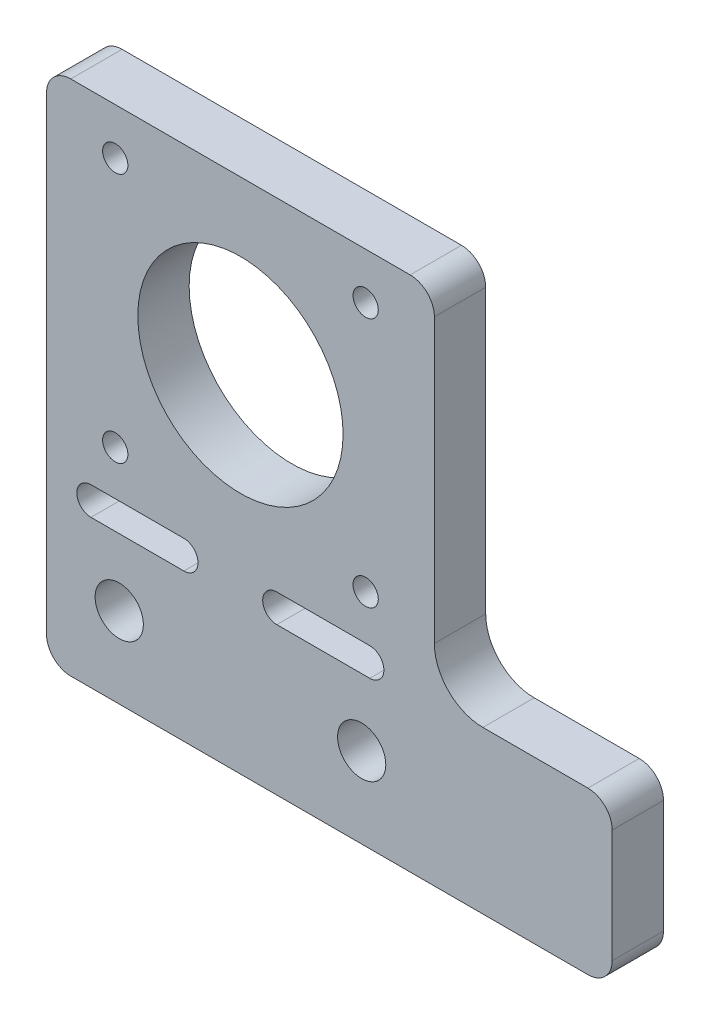
ISO-10303-21;
HEADER;
FILE_DESCRIPTION(('STEP AP214'),'2;1');
FILE_NAME('part.step','',(''),(''),'','','');
FILE_SCHEMA(('AUTOMOTIVE_DESIGN { 1 0 10303 214 1 1 1 1 }'));
ENDSEC;
DATA;
#1=APPLICATION_CONTEXT('core data for automotive mechanical design processes');
#2=APPLICATION_PROTOCOL_DEFINITION('international standard','automotive_design',2000,#1);
#3=PRODUCT_CONTEXT('',#1,'mechanical');
#4=PRODUCT('Part','Part','',(#3));
#5=PRODUCT_RELATED_PRODUCT_CATEGORY('part','',(#4));
#6=PRODUCT_DEFINITION_FORMATION('','',#4);
#7=PRODUCT_DEFINITION_CONTEXT('part definition',#1,'design');
#8=PRODUCT_DEFINITION('design','',#6,#7);
#9=PRODUCT_DEFINITION_SHAPE('','',#8);
#10=(LENGTH_UNIT() NAMED_UNIT(*) SI_UNIT(.MILLI.,.METRE.));
#11=(NAMED_UNIT(*) PLANE_ANGLE_UNIT() SI_UNIT($,.RADIAN.));
#12=(NAMED_UNIT(*) SI_UNIT($,.STERADIAN.) SOLID_ANGLE_UNIT());
#13=UNCERTAINTY_MEASURE_WITH_UNIT(LENGTH_MEASURE(1.E-05),#10,'distance_accuracy_value','');
#14=(GEOMETRIC_REPRESENTATION_CONTEXT(3) GLOBAL_UNCERTAINTY_ASSIGNED_CONTEXT((#13)) GLOBAL_UNIT_ASSIGNED_CONTEXT((#10,
#11,#12)) REPRESENTATION_CONTEXT('',''));
#15=CARTESIAN_POINT('',(0.,0.,0.));
#16=DIRECTION('',(0.,0.,1.));
#17=DIRECTION('',(1.,0.,0.));
#18=AXIS2_PLACEMENT_3D('',#15,#16,#17);
#19=CARTESIAN_POINT('',(363.68370158847,172.03385422472,6.35));
#20=DIRECTION('',(0.,0.,1.));
#21=DIRECTION('',(1.,0.,0.));
#22=AXIS2_PLACEMENT_3D('',#19,#20,#21);
#23=PLANE('',#22);
#24=CARTESIAN_POINT('',(369.18970158864,227.30138278266,6.35));
#25=DIRECTION('',(0.,0.,1.));
#26=DIRECTION('',(1.,0.,0.));
#27=AXIS2_PLACEMENT_3D('',#24,#25,#26);
#28=CIRCLE('',#27,1.5624999992);
#29=CARTESIAN_POINT('',(370.75220158784,227.30138278266,6.35));
#30=VERTEX_POINT('',#29);
#31=EDGE_CURVE('E649',#30,#30,#28,.T.);
#32=ORIENTED_EDGE('',*,*,#31,.F.);
#33=EDGE_LOOP('',(#32));
#34=FACE_BOUND('',#33,.T.);
#35=CARTESIAN_POINT('',(400.17770158864,196.31338278266,6.35));
#36=DIRECTION('',(0.,0.,1.));
#37=DIRECTION('',(1.,0.,0.));
#38=AXIS2_PLACEMENT_3D('',#35,#36,#37);
#39=CIRCLE('',#38,1.5624999992);
#40=CARTESIAN_POINT('',(401.74020158784,196.31338278266,6.35));
#41=VERTEX_POINT('',#40);
#42=EDGE_CURVE('E661',#41,#41,#39,.T.);
#43=ORIENTED_EDGE('',*,*,#42,.F.);
#44=EDGE_LOOP('',(#43));
#45=FACE_BOUND('',#44,.T.);
#46=CARTESIAN_POINT('',(399.68370158858,179.03385422266,6.35));
#47=DIRECTION('',(0.,0.,1.));
#48=DIRECTION('',(1.,0.,0.));
#49=AXIS2_PLACEMENT_3D('',#46,#47,#48);
#50=CIRCLE('',#49,2.9845);
#51=CARTESIAN_POINT('',(402.66820158858,179.03385422266,6.35));
#52=VERTEX_POINT('',#51);
#53=EDGE_CURVE('E673',#52,#52,#50,.T.);
#54=ORIENTED_EDGE('',*,*,#53,.F.);
#55=EDGE_LOOP('',(#54));
#56=FACE_BOUND('',#55,.T.);
#57=DIRECTION('',(1.,0.,0.));
#58=VECTOR('',#57,1.);
#59=CARTESIAN_POINT('',(389.18370158786,187.29953812814,6.35));
#60=LINE('',#59,#58);
#61=CARTESIAN_POINT('',(389.18370158786,187.29953812814,6.35));
#62=VERTEX_POINT('',#61);
#63=CARTESIAN_POINT('',(400.68370158756,187.29953812814,6.35));
#64=VERTEX_POINT('',#63);
#65=EDGE_CURVE('E176',#62,#64,#60,.T.);
#66=ORIENTED_EDGE('',*,*,#65,.F.);
#67=CARTESIAN_POINT('',(389.18370158786,189.04953812826,6.35));
#68=DIRECTION('',(0.,0.,1.));
#69=DIRECTION('',(1.,0.,0.));
#70=AXIS2_PLACEMENT_3D('',#67,#68,#69);
#71=CIRCLE('',#70,1.75000000012);
#72=CARTESIAN_POINT('',(389.18370158786,190.79953812838,6.35));
#73=VERTEX_POINT('',#72);
#74=EDGE_CURVE('E168',#73,#62,#71,.T.);
#75=ORIENTED_EDGE('',*,*,#74,.F.);
#76=DIRECTION('',(-1.,0.,0.));
#77=VECTOR('',#76,1.);
#78=CARTESIAN_POINT('',(400.68370158756,190.79953812838,6.35));
#79=LINE('',#78,#77);
#80=CARTESIAN_POINT('',(400.68370158756,190.79953812838,6.35));
#81=VERTEX_POINT('',#80);
#82=EDGE_CURVE('E191',#81,#73,#79,.T.);
#83=ORIENTED_EDGE('',*,*,#82,.F.);
#84=CARTESIAN_POINT('',(400.68370158756,189.04953812826,6.35));
#85=DIRECTION('',(0.,0.,1.));
#86=DIRECTION('',(1.,0.,0.));
#87=AXIS2_PLACEMENT_3D('',#84,#85,#86);
#88=CIRCLE('',#87,1.75000000012);
#89=EDGE_CURVE('E189',#64,#81,#88,.T.);
#90=ORIENTED_EDGE('',*,*,#89,.F.);
#91=EDGE_LOOP('',(#66,#75,#83,#90));
#92=FACE_BOUND('',#91,.T.);
#93=CARTESIAN_POINT('',(363.68370158847,172.03385422472,6.35));
#94=DIRECTION('',(0.,0.,1.));
#95=DIRECTION('',(1.,0.,0.));
#96=AXIS2_PLACEMENT_3D('',#93,#94,#95);
#97=CIRCLE('',#96,3.00000000075001);
#98=CARTESIAN_POINT('',(360.68370158772,172.03385422472,6.35));
#99=VERTEX_POINT('',#98);
#100=CARTESIAN_POINT('',(363.68370158847,169.03385422397,6.35));
#101=VERTEX_POINT('',#100);
#102=EDGE_CURVE('E238',#99,#101,#97,.T.);
#103=ORIENTED_EDGE('',*,*,#102,.T.);
#104=DIRECTION('',(1.,0.,0.));
#105=VECTOR('',#104,1.);
#106=CARTESIAN_POINT('',(363.68370158847,169.03385422397,6.35));
#107=LINE('',#106,#105);
#108=CARTESIAN_POINT('',(427.68370158923,169.03385422397,6.35));
#109=VERTEX_POINT('',#108);
#110=EDGE_CURVE('E241',#101,#109,#107,.T.);
#111=ORIENTED_EDGE('',*,*,#110,.T.);
#112=CARTESIAN_POINT('',(427.68370158923,172.03385422472,6.35));
#113=DIRECTION('',(0.,0.,1.));
#114=DIRECTION('',(1.,0.,0.));
#115=AXIS2_PLACEMENT_3D('',#112,#113,#114);
#116=CIRCLE('',#115,3.00000000075001);
#117=CARTESIAN_POINT('',(430.68370158998,172.03385422472,6.35));
#118=VERTEX_POINT('',#117);
#119=EDGE_CURVE('E244',#109,#118,#116,.T.);
#120=ORIENTED_EDGE('',*,*,#119,.T.);
#121=DIRECTION('',(0.,1.,0.));
#122=VECTOR('',#121,1.);
#123=CARTESIAN_POINT('',(430.68370158998,186.03385422314,6.35));
#124=LINE('',#123,#122);
#125=CARTESIAN_POINT('',(430.68370158998,186.03385422314,6.35));
#126=VERTEX_POINT('',#125);
#127=EDGE_CURVE('E246',#118,#126,#124,.T.);
#128=ORIENTED_EDGE('',*,*,#127,.T.);
#129=CARTESIAN_POINT('',(427.6837015905,186.03385422314,6.35));
#130=DIRECTION('',(0.,0.,1.));
#131=DIRECTION('',(1.,0.,0.));
#132=AXIS2_PLACEMENT_3D('',#129,#130,#131);
#133=CIRCLE('',#132,2.99999999948002);
#134=CARTESIAN_POINT('',(427.68370158796,189.03385422262,6.35));
#135=VERTEX_POINT('',#134);
#136=EDGE_CURVE('E248',#126,#135,#133,.T.);
#137=ORIENTED_EDGE('',*,*,#136,.T.);
#138=DIRECTION('',(-1.,0.,0.));
#139=VECTOR('',#138,1.);
#140=CARTESIAN_POINT('',(414.68370158852,189.03385422262,6.35));
#141=LINE('',#140,#139);
#142=CARTESIAN_POINT('',(414.68370158852,189.03385422262,6.35));
#143=VERTEX_POINT('',#142);
#144=EDGE_CURVE('E250',#135,#143,#141,.T.);
#145=ORIENTED_EDGE('',*,*,#144,.T.);
#146=CARTESIAN_POINT('',(414.68370158852,195.03385422412,6.35));
#147=DIRECTION('',(0.,0.,-1.));
#148=DIRECTION('',(1.,0.,0.));
#149=AXIS2_PLACEMENT_3D('',#146,#147,#148);
#150=CIRCLE('',#149,6.0000000015);
#151=CARTESIAN_POINT('',(408.68370158702,195.03385422412,6.35));
#152=VERTEX_POINT('',#151);
#153=EDGE_CURVE('E252',#143,#152,#150,.T.);
#154=ORIENTED_EDGE('',*,*,#153,.T.);
#155=DIRECTION('',(0.,1.,0.));
#156=VECTOR('',#155,1.);
#157=CARTESIAN_POINT('',(408.68370158702,195.03385422412,6.35));
#158=LINE('',#157,#156);
#159=CARTESIAN_POINT('',(408.68370158702,230.03385422398,6.35));
#160=VERTEX_POINT('',#159);
#161=EDGE_CURVE('E254',#152,#160,#158,.T.);
#162=ORIENTED_EDGE('',*,*,#161,.T.);
#163=CARTESIAN_POINT('',(405.68370158754,230.03385422398,6.35));
#164=DIRECTION('',(0.,0.,1.));
#165=DIRECTION('',(1.,0.,0.));
#166=AXIS2_PLACEMENT_3D('',#163,#164,#165);
#167=CIRCLE('',#166,2.99999999948002);
#168=CARTESIAN_POINT('',(405.68370158754,233.03385422346,6.35));
#169=VERTEX_POINT('',#168);
#170=EDGE_CURVE('E256',#160,#169,#167,.T.);
#171=ORIENTED_EDGE('',*,*,#170,.T.);
#172=DIRECTION('',(-1.,0.,0.));
#173=VECTOR('',#172,1.);
#174=CARTESIAN_POINT('',(405.68370158754,233.03385422346,6.35));
#175=LINE('',#174,#173);
#176=CARTESIAN_POINT('',(363.6837015872,233.03385422346,6.35));
#177=VERTEX_POINT('',#176);
#178=EDGE_CURVE('E258',#169,#177,#175,.T.);
#179=ORIENTED_EDGE('',*,*,#178,.T.);
#180=CARTESIAN_POINT('',(363.6837015872,230.03385422398,6.35));
#181=DIRECTION('',(0.,0.,1.));
#182=DIRECTION('',(1.,0.,0.));
#183=AXIS2_PLACEMENT_3D('',#180,#181,#182);
#184=CIRCLE('',#183,2.99999999948002);
#185=CARTESIAN_POINT('',(360.68370158772,230.03385422398,6.35));
#186=VERTEX_POINT('',#185);
#187=EDGE_CURVE('E260',#177,#186,#184,.T.);
#188=ORIENTED_EDGE('',*,*,#187,.T.);
#189=DIRECTION('',(0.,-1.,0.));
#190=VECTOR('',#189,1.);
#191=CARTESIAN_POINT('',(360.68370158772,230.03385422398,6.35));
#192=LINE('',#191,#190);
#193=EDGE_CURVE('E262',#186,#99,#192,.T.);
#194=ORIENTED_EDGE('',*,*,#193,.T.);
#195=EDGE_LOOP('',(#103,#111,#120,#128,#137,#145,#154,#162,#171,#179,#188,#194));
#196=FACE_BOUND('',#195,.T.);
#197=DIRECTION('',(1.,0.,0.));
#198=VECTOR('',#197,1.);
#199=CARTESIAN_POINT('',(366.18370158846,187.29953812814,6.35));
#200=LINE('',#199,#198);
#201=CARTESIAN_POINT('',(366.18370158846,187.29953812814,6.35));
#202=VERTEX_POINT('',#201);
#203=CARTESIAN_POINT('',(377.68370158816,187.29953812814,6.35));
#204=VERTEX_POINT('',#203);
#205=EDGE_CURVE('E209',#202,#204,#200,.T.);
#206=ORIENTED_EDGE('',*,*,#205,.F.);
#207=CARTESIAN_POINT('',(366.18370158846,189.04953812826,6.35));
#208=DIRECTION('',(0.,0.,1.));
#209=DIRECTION('',(1.,0.,0.));
#210=AXIS2_PLACEMENT_3D('',#207,#208,#209);
#211=CIRCLE('',#210,1.75000000012);
#212=CARTESIAN_POINT('',(366.18370158846,190.79953812838,6.35));
#213=VERTEX_POINT('',#212);
#214=EDGE_CURVE('E207',#213,#202,#211,.T.);
#215=ORIENTED_EDGE('',*,*,#214,.F.);
#216=DIRECTION('',(-1.,0.,0.));
#217=VECTOR('',#216,1.);
#218=CARTESIAN_POINT('',(377.68370158816,190.79953812838,6.35));
#219=LINE('',#218,#217);
#220=CARTESIAN_POINT('',(377.68370158816,190.79953812838,6.35));
#221=VERTEX_POINT('',#220);
#222=EDGE_CURVE('E215',#221,#213,#219,.T.);
#223=ORIENTED_EDGE('',*,*,#222,.F.);
#224=CARTESIAN_POINT('',(377.68370158816,189.04953812826,6.35));
#225=DIRECTION('',(0.,0.,1.));
#226=DIRECTION('',(1.,0.,0.));
#227=AXIS2_PLACEMENT_3D('',#224,#225,#226);
#228=CIRCLE('',#227,1.75000000012);
#229=EDGE_CURVE('E212',#204,#221,#228,.T.);
#230=ORIENTED_EDGE('',*,*,#229,.F.);
#231=EDGE_LOOP('',(#206,#215,#223,#230));
#232=FACE_BOUND('',#231,.T.);
#233=CARTESIAN_POINT('',(369.6837015887,179.03385422266,6.35));
#234=DIRECTION('',(0.,0.,1.));
#235=DIRECTION('',(1.,0.,0.));
#236=AXIS2_PLACEMENT_3D('',#233,#234,#235);
#237=CIRCLE('',#236,2.9845);
#238=CARTESIAN_POINT('',(372.6682015887,179.03385422266,6.35));
#239=VERTEX_POINT('',#238);
#240=EDGE_CURVE('E197',#239,#239,#237,.T.);
#241=ORIENTED_EDGE('',*,*,#240,.F.);
#242=EDGE_LOOP('',(#241));
#243=FACE_BOUND('',#242,.T.);
#244=CARTESIAN_POINT('',(369.18970158864,196.31338278266,6.35));
#245=DIRECTION('',(0.,0.,1.));
#246=DIRECTION('',(1.,0.,0.));
#247=AXIS2_PLACEMENT_3D('',#244,#245,#246);
#248=CIRCLE('',#247,1.5624999992);
#249=CARTESIAN_POINT('',(370.75220158784,196.31338278266,6.35));
#250=VERTEX_POINT('',#249);
#251=EDGE_CURVE('E667',#250,#250,#248,.T.);
#252=ORIENTED_EDGE('',*,*,#251,.F.);
#253=EDGE_LOOP('',(#252));
#254=FACE_BOUND('',#253,.T.);
#255=CARTESIAN_POINT('',(384.68370158864,211.80738278266,6.35));
#256=DIRECTION('',(0.,0.,1.));
#257=DIRECTION('',(1.,0.,0.));
#258=AXIS2_PLACEMENT_3D('',#255,#256,#257);
#259=CIRCLE('',#258,12.7);
#260=CARTESIAN_POINT('',(397.38370158864,211.80738278266,6.35));
#261=VERTEX_POINT('',#260);
#262=EDGE_CURVE('E655',#261,#261,#259,.T.);
#263=ORIENTED_EDGE('',*,*,#262,.F.);
#264=EDGE_LOOP('',(#263));
#265=FACE_BOUND('',#264,.T.);
#266=CARTESIAN_POINT('',(400.17770158864,227.30138278266,6.35));
#267=DIRECTION('',(0.,0.,1.));
#268=DIRECTION('',(1.,0.,0.));
#269=AXIS2_PLACEMENT_3D('',#266,#267,#268);
#270=CIRCLE('',#269,1.5624999992);
#271=CARTESIAN_POINT('',(401.74020158784,227.30138278266,6.35));
#272=VERTEX_POINT('',#271);
#273=EDGE_CURVE('E640',#272,#272,#270,.T.);
#274=ORIENTED_EDGE('',*,*,#273,.F.);
#275=EDGE_LOOP('',(#274));
#276=FACE_BOUND('',#275,.T.);
#277=ADVANCED_FACE('F31',(#34,#45,#56,#92,#196,#232,#243,#254,#265,#276),#23,.T.);
#278=CARTESIAN_POINT('',(363.68370158847,172.03385422472,0.));
#279=DIRECTION('',(0.,0.,1.));
#280=DIRECTION('',(1.,0.,0.));
#281=AXIS2_PLACEMENT_3D('',#278,#279,#280);
#282=PLANE('',#281);
#283=CARTESIAN_POINT('',(369.18970158864,227.30138278266,0.));
#284=DIRECTION('',(0.,0.,1.));
#285=DIRECTION('',(1.,0.,0.));
#286=AXIS2_PLACEMENT_3D('',#283,#284,#285);
#287=CIRCLE('',#286,1.5624999992);
#288=CARTESIAN_POINT('',(370.75220158784,227.30138278266,0.));
#289=VERTEX_POINT('',#288);
#290=EDGE_CURVE('E646',#289,#289,#287,.T.);
#291=ORIENTED_EDGE('',*,*,#290,.T.);
#292=EDGE_LOOP('',(#291));
#293=FACE_BOUND('',#292,.T.);
#294=CARTESIAN_POINT('',(400.17770158864,196.31338278266,0.));
#295=DIRECTION('',(0.,0.,1.));
#296=DIRECTION('',(1.,0.,0.));
#297=AXIS2_PLACEMENT_3D('',#294,#295,#296);
#298=CIRCLE('',#297,1.5624999992);
#299=CARTESIAN_POINT('',(401.74020158784,196.31338278266,0.));
#300=VERTEX_POINT('',#299);
#301=EDGE_CURVE('E658',#300,#300,#298,.T.);
#302=ORIENTED_EDGE('',*,*,#301,.T.);
#303=EDGE_LOOP('',(#302));
#304=FACE_BOUND('',#303,.T.);
#305=CARTESIAN_POINT('',(399.68370158858,179.03385422266,0.));
#306=DIRECTION('',(0.,0.,1.));
#307=DIRECTION('',(1.,0.,0.));
#308=AXIS2_PLACEMENT_3D('',#305,#306,#307);
#309=CIRCLE('',#308,2.9845);
#310=CARTESIAN_POINT('',(402.66820158858,179.03385422266,0.));
#311=VERTEX_POINT('',#310);
#312=EDGE_CURVE('E670',#311,#311,#309,.T.);
#313=ORIENTED_EDGE('',*,*,#312,.T.);
#314=EDGE_LOOP('',(#313));
#315=FACE_BOUND('',#314,.T.);
#316=CARTESIAN_POINT('',(389.18370158786,189.04953812826,0.));
#317=DIRECTION('',(0.,0.,1.));
#318=DIRECTION('',(1.,0.,0.));
#319=AXIS2_PLACEMENT_3D('',#316,#317,#318);
#320=CIRCLE('',#319,1.75000000012);
#321=CARTESIAN_POINT('',(389.18370158786,190.79953812838,0.));
#322=VERTEX_POINT('',#321);
#323=CARTESIAN_POINT('',(389.18370158786,187.29953812814,0.));
#324=VERTEX_POINT('',#323);
#325=EDGE_CURVE('E54',#322,#324,#320,.T.);
#326=ORIENTED_EDGE('',*,*,#325,.T.);
#327=DIRECTION('',(1.,0.,0.));
#328=VECTOR('',#327,1.);
#329=CARTESIAN_POINT('',(389.18370158786,187.29953812814,0.));
#330=LINE('',#329,#328);
#331=CARTESIAN_POINT('',(400.68370158756,187.29953812814,0.));
#332=VERTEX_POINT('',#331);
#333=EDGE_CURVE('E183',#324,#332,#330,.T.);
#334=ORIENTED_EDGE('',*,*,#333,.T.);
#335=CARTESIAN_POINT('',(400.68370158756,189.04953812826,0.));
#336=DIRECTION('',(0.,0.,1.));
#337=DIRECTION('',(1.,0.,0.));
#338=AXIS2_PLACEMENT_3D('',#335,#336,#337);
#339=CIRCLE('',#338,1.75000000012);
#340=CARTESIAN_POINT('',(400.68370158756,190.79953812838,0.));
#341=VERTEX_POINT('',#340);
#342=EDGE_CURVE('E199',#332,#341,#339,.T.);
#343=ORIENTED_EDGE('',*,*,#342,.T.);
#344=DIRECTION('',(-1.,0.,0.));
#345=VECTOR('',#344,1.);
#346=CARTESIAN_POINT('',(400.68370158756,190.79953812838,0.));
#347=LINE('',#346,#345);
#348=EDGE_CURVE('E177',#341,#322,#347,.T.);
#349=ORIENTED_EDGE('',*,*,#348,.T.);
#350=EDGE_LOOP('',(#326,#334,#343,#349));
#351=FACE_BOUND('',#350,.T.);
#352=CARTESIAN_POINT('',(363.68370158847,172.03385422472,0.));
#353=DIRECTION('',(0.,0.,1.));
#354=DIRECTION('',(1.,0.,0.));
#355=AXIS2_PLACEMENT_3D('',#352,#353,#354);
#356=CIRCLE('',#355,3.00000000075001);
#357=CARTESIAN_POINT('',(360.68370158772,172.03385422472,0.));
#358=VERTEX_POINT('',#357);
#359=CARTESIAN_POINT('',(363.68370158847,169.03385422397,0.));
#360=VERTEX_POINT('',#359);
#361=EDGE_CURVE('E237',#358,#360,#356,.T.);
#362=ORIENTED_EDGE('',*,*,#361,.F.);
#363=DIRECTION('',(0.,-1.,0.));
#364=VECTOR('',#363,1.);
#365=CARTESIAN_POINT('',(360.68370158772,230.03385422398,0.));
#366=LINE('',#365,#364);
#367=CARTESIAN_POINT('',(360.68370158772,230.03385422398,0.));
#368=VERTEX_POINT('',#367);
#369=EDGE_CURVE('E242',#368,#358,#366,.T.);
#370=ORIENTED_EDGE('',*,*,#369,.F.);
#371=CARTESIAN_POINT('',(363.6837015872,230.03385422398,0.));
#372=DIRECTION('',(0.,0.,1.));
#373=DIRECTION('',(1.,0.,0.));
#374=AXIS2_PLACEMENT_3D('',#371,#372,#373);
#375=CIRCLE('',#374,2.99999999948002);
#376=CARTESIAN_POINT('',(363.6837015872,233.03385422346,0.));
#377=VERTEX_POINT('',#376);
#378=EDGE_CURVE('E285',#377,#368,#375,.T.);
#379=ORIENTED_EDGE('',*,*,#378,.F.);
#380=DIRECTION('',(-1.,0.,0.));
#381=VECTOR('',#380,1.);
#382=CARTESIAN_POINT('',(405.68370158754,233.03385422346,0.));
#383=LINE('',#382,#381);
#384=CARTESIAN_POINT('',(405.68370158754,233.03385422346,0.));
#385=VERTEX_POINT('',#384);
#386=EDGE_CURVE('E283',#385,#377,#383,.T.);
#387=ORIENTED_EDGE('',*,*,#386,.F.);
#388=CARTESIAN_POINT('',(405.68370158754,230.03385422398,0.));
#389=DIRECTION('',(0.,0.,1.));
#390=DIRECTION('',(1.,0.,0.));
#391=AXIS2_PLACEMENT_3D('',#388,#389,#390);
#392=CIRCLE('',#391,2.99999999948002);
#393=CARTESIAN_POINT('',(408.68370158702,230.03385422398,0.));
#394=VERTEX_POINT('',#393);
#395=EDGE_CURVE('E281',#394,#385,#392,.T.);
#396=ORIENTED_EDGE('',*,*,#395,.F.);
#397=DIRECTION('',(0.,1.,0.));
#398=VECTOR('',#397,1.);
#399=CARTESIAN_POINT('',(408.68370158702,195.03385422412,0.));
#400=LINE('',#399,#398);
#401=CARTESIAN_POINT('',(408.68370158702,195.03385422412,0.));
#402=VERTEX_POINT('',#401);
#403=EDGE_CURVE('E279',#402,#394,#400,.T.);
#404=ORIENTED_EDGE('',*,*,#403,.F.);
#405=CARTESIAN_POINT('',(414.68370158852,195.03385422412,0.));
#406=DIRECTION('',(0.,0.,-1.));
#407=DIRECTION('',(1.,0.,0.));
#408=AXIS2_PLACEMENT_3D('',#405,#406,#407);
#409=CIRCLE('',#408,6.0000000015);
#410=CARTESIAN_POINT('',(414.68370158852,189.03385422262,0.));
#411=VERTEX_POINT('',#410);
#412=EDGE_CURVE('E277',#411,#402,#409,.T.);
#413=ORIENTED_EDGE('',*,*,#412,.F.);
#414=DIRECTION('',(-1.,0.,0.));
#415=VECTOR('',#414,1.);
#416=CARTESIAN_POINT('',(414.68370158852,189.03385422262,0.));
#417=LINE('',#416,#415);
#418=CARTESIAN_POINT('',(427.68370158796,189.03385422262,0.));
#419=VERTEX_POINT('',#418);
#420=EDGE_CURVE('E275',#419,#411,#417,.T.);
#421=ORIENTED_EDGE('',*,*,#420,.F.);
#422=CARTESIAN_POINT('',(427.6837015905,186.03385422314,0.));
#423=DIRECTION('',(0.,0.,1.));
#424=DIRECTION('',(1.,0.,0.));
#425=AXIS2_PLACEMENT_3D('',#422,#423,#424);
#426=CIRCLE('',#425,2.99999999948002);
#427=CARTESIAN_POINT('',(430.68370158998,186.03385422314,0.));
#428=VERTEX_POINT('',#427);
#429=EDGE_CURVE('E273',#428,#419,#426,.T.);
#430=ORIENTED_EDGE('',*,*,#429,.F.);
#431=DIRECTION('',(0.,1.,0.));
#432=VECTOR('',#431,1.);
#433=CARTESIAN_POINT('',(430.68370158998,186.03385422314,0.));
#434=LINE('',#433,#432);
#435=CARTESIAN_POINT('',(430.68370158998,172.03385422472,0.));
#436=VERTEX_POINT('',#435);
#437=EDGE_CURVE('E271',#436,#428,#434,.T.);
#438=ORIENTED_EDGE('',*,*,#437,.F.);
#439=CARTESIAN_POINT('',(427.68370158923,172.03385422472,0.));
#440=DIRECTION('',(0.,0.,1.));
#441=DIRECTION('',(1.,0.,0.));
#442=AXIS2_PLACEMENT_3D('',#439,#440,#441);
#443=CIRCLE('',#442,3.00000000075001);
#444=CARTESIAN_POINT('',(427.68370158923,169.03385422397,0.));
#445=VERTEX_POINT('',#444);
#446=EDGE_CURVE('E269',#445,#436,#443,.T.);
#447=ORIENTED_EDGE('',*,*,#446,.F.);
#448=DIRECTION('',(1.,0.,0.));
#449=VECTOR('',#448,1.);
#450=CARTESIAN_POINT('',(363.68370158847,169.03385422397,0.));
#451=LINE('',#450,#449);
#452=EDGE_CURVE('E267',#360,#445,#451,.T.);
#453=ORIENTED_EDGE('',*,*,#452,.F.);
#454=EDGE_LOOP('',(#362,#370,#379,#387,#396,#404,#413,#421,#430,#438,#447,#453));
#455=FACE_BOUND('',#454,.T.);
#456=CARTESIAN_POINT('',(366.18370158846,189.04953812826,0.));
#457=DIRECTION('',(0.,0.,1.));
#458=DIRECTION('',(1.,0.,0.));
#459=AXIS2_PLACEMENT_3D('',#456,#457,#458);
#460=CIRCLE('',#459,1.75000000012);
#461=CARTESIAN_POINT('',(366.18370158846,190.79953812838,0.));
#462=VERTEX_POINT('',#461);
#463=CARTESIAN_POINT('',(366.18370158846,187.29953812814,0.));
#464=VERTEX_POINT('',#463);
#465=EDGE_CURVE('E184',#462,#464,#460,.T.);
#466=ORIENTED_EDGE('',*,*,#465,.T.);
#467=DIRECTION('',(1.,0.,0.));
#468=VECTOR('',#467,1.);
#469=CARTESIAN_POINT('',(366.18370158846,187.29953812814,0.));
#470=LINE('',#469,#468);
#471=CARTESIAN_POINT('',(377.68370158816,187.29953812814,0.));
#472=VERTEX_POINT('',#471);
#473=EDGE_CURVE('E220',#464,#472,#470,.T.);
#474=ORIENTED_EDGE('',*,*,#473,.T.);
#475=CARTESIAN_POINT('',(377.68370158816,189.04953812826,0.));
#476=DIRECTION('',(0.,0.,1.));
#477=DIRECTION('',(1.,0.,0.));
#478=AXIS2_PLACEMENT_3D('',#475,#476,#477);
#479=CIRCLE('',#478,1.75000000012);
#480=CARTESIAN_POINT('',(377.68370158816,190.79953812838,0.));
#481=VERTEX_POINT('',#480);
#482=EDGE_CURVE('E223',#472,#481,#479,.T.);
#483=ORIENTED_EDGE('',*,*,#482,.T.);
#484=DIRECTION('',(-1.,0.,0.));
#485=VECTOR('',#484,1.);
#486=CARTESIAN_POINT('',(377.68370158816,190.79953812838,0.));
#487=LINE('',#486,#485);
#488=EDGE_CURVE('E210',#481,#462,#487,.T.);
#489=ORIENTED_EDGE('',*,*,#488,.T.);
#490=EDGE_LOOP('',(#466,#474,#483,#489));
#491=FACE_BOUND('',#490,.T.);
#492=CARTESIAN_POINT('',(369.6837015887,179.03385422266,0.));
#493=DIRECTION('',(0.,0.,1.));
#494=DIRECTION('',(1.,0.,0.));
#495=AXIS2_PLACEMENT_3D('',#492,#493,#494);
#496=CIRCLE('',#495,2.9845);
#497=CARTESIAN_POINT('',(372.6682015887,179.03385422266,0.));
#498=VERTEX_POINT('',#497);
#499=EDGE_CURVE('E676',#498,#498,#496,.T.);
#500=ORIENTED_EDGE('',*,*,#499,.T.);
#501=EDGE_LOOP('',(#500));
#502=FACE_BOUND('',#501,.T.);
#503=CARTESIAN_POINT('',(369.18970158864,196.31338278266,0.));
#504=DIRECTION('',(0.,0.,1.));
#505=DIRECTION('',(1.,0.,0.));
#506=AXIS2_PLACEMENT_3D('',#503,#504,#505);
#507=CIRCLE('',#506,1.5624999992);
#508=CARTESIAN_POINT('',(370.75220158784,196.31338278266,0.));
#509=VERTEX_POINT('',#508);
#510=EDGE_CURVE('E664',#509,#509,#507,.T.);
#511=ORIENTED_EDGE('',*,*,#510,.T.);
#512=EDGE_LOOP('',(#511));
#513=FACE_BOUND('',#512,.T.);
#514=CARTESIAN_POINT('',(384.68370158864,211.80738278266,0.));
#515=DIRECTION('',(0.,0.,1.));
#516=DIRECTION('',(1.,0.,0.));
#517=AXIS2_PLACEMENT_3D('',#514,#515,#516);
#518=CIRCLE('',#517,12.7);
#519=CARTESIAN_POINT('',(397.38370158864,211.80738278266,0.));
#520=VERTEX_POINT('',#519);
#521=EDGE_CURVE('E652',#520,#520,#518,.T.);
#522=ORIENTED_EDGE('',*,*,#521,.T.);
#523=EDGE_LOOP('',(#522));
#524=FACE_BOUND('',#523,.T.);
#525=CARTESIAN_POINT('',(400.17770158864,227.30138278266,0.));
#526=DIRECTION('',(0.,0.,1.));
#527=DIRECTION('',(1.,0.,0.));
#528=AXIS2_PLACEMENT_3D('',#525,#526,#527);
#529=CIRCLE('',#528,1.5624999992);
#530=CARTESIAN_POINT('',(401.74020158784,227.30138278266,0.));
#531=VERTEX_POINT('',#530);
#532=EDGE_CURVE('E643',#531,#531,#529,.T.);
#533=ORIENTED_EDGE('',*,*,#532,.T.);
#534=EDGE_LOOP('',(#533));
#535=FACE_BOUND('',#534,.T.);
#536=ADVANCED_FACE('F327',(#293,#304,#315,#351,#455,#491,#502,#513,#524,#535),#282,.F.);
#537=CARTESIAN_POINT('',(363.68370158847,172.03385422472,6.35));
#538=DIRECTION('',(0.,0.,-1.));
#539=DIRECTION('',(-1.,0.,0.));
#540=AXIS2_PLACEMENT_3D('',#537,#538,#539);
#541=CYLINDRICAL_SURFACE('',#540,3.00000000075001);
#542=ORIENTED_EDGE('',*,*,#361,.T.);
#543=DIRECTION('',(0.,0.,-1.));
#544=VECTOR('',#543,1.);
#545=CARTESIAN_POINT('',(363.68370158847,169.03385422397,6.35));
#546=LINE('',#545,#544);
#547=EDGE_CURVE('E11',#101,#360,#546,.T.);
#548=ORIENTED_EDGE('',*,*,#547,.F.);
#549=ORIENTED_EDGE('',*,*,#102,.F.);
#550=DIRECTION('',(0.,0.,-1.));
#551=VECTOR('',#550,1.);
#552=CARTESIAN_POINT('',(360.68370158772,172.03385422472,6.35));
#553=LINE('',#552,#551);
#554=EDGE_CURVE('E264',#99,#358,#553,.T.);
#555=ORIENTED_EDGE('',*,*,#554,.T.);
#556=EDGE_LOOP('',(#542,#548,#549,#555));
#557=FACE_BOUND('',#556,.T.);
#558=ADVANCED_FACE('F33',(#557),#541,.T.);
#559=CARTESIAN_POINT('',(363.68370158847,169.03385422397,6.35));
#560=DIRECTION('',(0.,1.,0.));
#561=DIRECTION('',(0.,0.,1.));
#562=AXIS2_PLACEMENT_3D('',#559,#560,#561);
#563=PLANE('',#562);
#564=ORIENTED_EDGE('',*,*,#452,.T.);
#565=DIRECTION('',(0.,0.,-1.));
#566=VECTOR('',#565,1.);
#567=CARTESIAN_POINT('',(427.68370158923,169.03385422397,6.35));
#568=LINE('',#567,#566);
#569=EDGE_CURVE('E39',#109,#445,#568,.T.);
#570=ORIENTED_EDGE('',*,*,#569,.F.);
#571=ORIENTED_EDGE('',*,*,#110,.F.);
#572=ORIENTED_EDGE('',*,*,#547,.T.);
#573=EDGE_LOOP('',(#564,#570,#571,#572));
#574=FACE_BOUND('',#573,.T.);
#575=ADVANCED_FACE('F344',(#574),#563,.F.);
#576=CARTESIAN_POINT('',(427.68370158923,172.03385422472,6.35));
#577=DIRECTION('',(0.,0.,-1.));
#578=DIRECTION('',(-1.,0.,0.));
#579=AXIS2_PLACEMENT_3D('',#576,#577,#578);
#580=CYLINDRICAL_SURFACE('',#579,3.00000000075001);
#581=ORIENTED_EDGE('',*,*,#446,.T.);
#582=DIRECTION('',(0.,0.,-1.));
#583=VECTOR('',#582,1.);
#584=CARTESIAN_POINT('',(430.68370158998,172.03385422472,6.35));
#585=LINE('',#584,#583);
#586=EDGE_CURVE('E314',#118,#436,#585,.T.);
#587=ORIENTED_EDGE('',*,*,#586,.F.);
#588=ORIENTED_EDGE('',*,*,#119,.F.);
#589=ORIENTED_EDGE('',*,*,#569,.T.);
#590=EDGE_LOOP('',(#581,#587,#588,#589));
#591=FACE_BOUND('',#590,.T.);
#592=ADVANCED_FACE('F321',(#591),#580,.T.);
#593=CARTESIAN_POINT('',(430.68370158998,186.03385422314,6.35));
#594=DIRECTION('',(-1.,0.,0.));
#595=DIRECTION('',(0.,0.,1.));
#596=AXIS2_PLACEMENT_3D('',#593,#594,#595);
#597=PLANE('',#596);
#598=ORIENTED_EDGE('',*,*,#437,.T.);
#599=DIRECTION('',(0.,0.,-1.));
#600=VECTOR('',#599,1.);
#601=CARTESIAN_POINT('',(430.68370158998,186.03385422314,6.35));
#602=LINE('',#601,#600);
#603=EDGE_CURVE('E311',#126,#428,#602,.T.);
#604=ORIENTED_EDGE('',*,*,#603,.F.);
#605=ORIENTED_EDGE('',*,*,#127,.F.);
#606=ORIENTED_EDGE('',*,*,#586,.T.);
#607=EDGE_LOOP('',(#598,#604,#605,#606));
#608=FACE_BOUND('',#607,.T.);
#609=ADVANCED_FACE('F333',(#608),#597,.F.);
#610=CARTESIAN_POINT('',(427.6837015905,186.03385422314,6.35));
#611=DIRECTION('',(0.,0.,-1.));
#612=DIRECTION('',(-1.,0.,0.));
#613=AXIS2_PLACEMENT_3D('',#610,#611,#612);
#614=CYLINDRICAL_SURFACE('',#613,2.99999999948002);
#615=ORIENTED_EDGE('',*,*,#429,.T.);
#616=DIRECTION('',(0.,0.,-1.));
#617=VECTOR('',#616,1.);
#618=CARTESIAN_POINT('',(427.68370158796,189.03385422262,6.35));
#619=LINE('',#618,#617);
#620=EDGE_CURVE('E308',#135,#419,#619,.T.);
#621=ORIENTED_EDGE('',*,*,#620,.F.);
#622=ORIENTED_EDGE('',*,*,#136,.F.);
#623=ORIENTED_EDGE('',*,*,#603,.T.);
#624=EDGE_LOOP('',(#615,#621,#622,#623));
#625=FACE_BOUND('',#624,.T.);
#626=ADVANCED_FACE('F337',(#625),#614,.T.);
#627=CARTESIAN_POINT('',(414.68370158852,189.03385422262,6.35));
#628=DIRECTION('',(0.,-1.,0.));
#629=DIRECTION('',(0.,0.,-1.));
#630=AXIS2_PLACEMENT_3D('',#627,#628,#629);
#631=PLANE('',#630);
#632=ORIENTED_EDGE('',*,*,#420,.T.);
#633=DIRECTION('',(0.,0.,-1.));
#634=VECTOR('',#633,1.);
#635=CARTESIAN_POINT('',(414.68370158852,189.03385422262,6.35));
#636=LINE('',#635,#634);
#637=EDGE_CURVE('E305',#143,#411,#636,.T.);
#638=ORIENTED_EDGE('',*,*,#637,.F.);
#639=ORIENTED_EDGE('',*,*,#144,.F.);
#640=ORIENTED_EDGE('',*,*,#620,.T.);
#641=EDGE_LOOP('',(#632,#638,#639,#640));
#642=FACE_BOUND('',#641,.T.);
#643=ADVANCED_FACE('F377',(#642),#631,.F.);
#644=CARTESIAN_POINT('',(414.68370158852,195.03385422412,6.35));
#645=DIRECTION('',(0.,0.,-1.));
#646=DIRECTION('',(-1.,0.,0.));
#647=AXIS2_PLACEMENT_3D('',#644,#645,#646);
#648=CYLINDRICAL_SURFACE('',#647,6.0000000015);
#649=ORIENTED_EDGE('',*,*,#412,.T.);
#650=DIRECTION('',(0.,0.,-1.));
#651=VECTOR('',#650,1.);
#652=CARTESIAN_POINT('',(408.68370158702,195.03385422412,6.35));
#653=LINE('',#652,#651);
#654=EDGE_CURVE('E302',#152,#402,#653,.T.);
#655=ORIENTED_EDGE('',*,*,#654,.F.);
#656=ORIENTED_EDGE('',*,*,#153,.F.);
#657=ORIENTED_EDGE('',*,*,#637,.T.);
#658=EDGE_LOOP('',(#649,#655,#656,#657));
#659=FACE_BOUND('',#658,.T.);
#660=ADVANCED_FACE('F375',(#659),#648,.F.);
#661=CARTESIAN_POINT('',(408.68370158702,195.03385422412,6.35));
#662=DIRECTION('',(-1.,0.,0.));
#663=DIRECTION('',(0.,0.,1.));
#664=AXIS2_PLACEMENT_3D('',#661,#662,#663);
#665=PLANE('',#664);
#666=ORIENTED_EDGE('',*,*,#403,.T.);
#667=DIRECTION('',(0.,0.,-1.));
#668=VECTOR('',#667,1.);
#669=CARTESIAN_POINT('',(408.68370158702,230.03385422398,6.35));
#670=LINE('',#669,#668);
#671=EDGE_CURVE('E299',#160,#394,#670,.T.);
#672=ORIENTED_EDGE('',*,*,#671,.F.);
#673=ORIENTED_EDGE('',*,*,#161,.F.);
#674=ORIENTED_EDGE('',*,*,#654,.T.);
#675=EDGE_LOOP('',(#666,#672,#673,#674));
#676=FACE_BOUND('',#675,.T.);
#677=ADVANCED_FACE('F371',(#676),#665,.F.);
#678=CARTESIAN_POINT('',(405.68370158754,230.03385422398,6.35));
#679=DIRECTION('',(0.,0.,-1.));
#680=DIRECTION('',(-1.,0.,0.));
#681=AXIS2_PLACEMENT_3D('',#678,#679,#680);
#682=CYLINDRICAL_SURFACE('',#681,2.99999999948002);
#683=ORIENTED_EDGE('',*,*,#395,.T.);
#684=DIRECTION('',(0.,0.,-1.));
#685=VECTOR('',#684,1.);
#686=CARTESIAN_POINT('',(405.68370158754,233.03385422346,6.35));
#687=LINE('',#686,#685);
#688=EDGE_CURVE('E296',#169,#385,#687,.T.);
#689=ORIENTED_EDGE('',*,*,#688,.F.);
#690=ORIENTED_EDGE('',*,*,#170,.F.);
#691=ORIENTED_EDGE('',*,*,#671,.T.);
#692=EDGE_LOOP('',(#683,#689,#690,#691));
#693=FACE_BOUND('',#692,.T.);
#694=ADVANCED_FACE('F366',(#693),#682,.T.);
#695=CARTESIAN_POINT('',(405.68370158754,233.03385422346,6.35));
#696=DIRECTION('',(0.,-1.,0.));
#697=DIRECTION('',(0.,0.,-1.));
#698=AXIS2_PLACEMENT_3D('',#695,#696,#697);
#699=PLANE('',#698);
#700=ORIENTED_EDGE('',*,*,#386,.T.);
#701=DIRECTION('',(0.,0.,-1.));
#702=VECTOR('',#701,1.);
#703=CARTESIAN_POINT('',(363.6837015872,233.03385422346,6.35));
#704=LINE('',#703,#702);
#705=EDGE_CURVE('E293',#177,#377,#704,.T.);
#706=ORIENTED_EDGE('',*,*,#705,.F.);
#707=ORIENTED_EDGE('',*,*,#178,.F.);
#708=ORIENTED_EDGE('',*,*,#688,.T.);
#709=EDGE_LOOP('',(#700,#706,#707,#708));
#710=FACE_BOUND('',#709,.T.);
#711=ADVANCED_FACE('F360',(#710),#699,.F.);
#712=CARTESIAN_POINT('',(363.6837015872,230.03385422398,6.35));
#713=DIRECTION('',(0.,0.,-1.));
#714=DIRECTION('',(-1.,0.,0.));
#715=AXIS2_PLACEMENT_3D('',#712,#713,#714);
#716=CYLINDRICAL_SURFACE('',#715,2.99999999948002);
#717=ORIENTED_EDGE('',*,*,#378,.T.);
#718=DIRECTION('',(0.,0.,-1.));
#719=VECTOR('',#718,1.);
#720=CARTESIAN_POINT('',(360.68370158772,230.03385422398,6.35));
#721=LINE('',#720,#719);
#722=EDGE_CURVE('E290',#186,#368,#721,.T.);
#723=ORIENTED_EDGE('',*,*,#722,.F.);
#724=ORIENTED_EDGE('',*,*,#187,.F.);
#725=ORIENTED_EDGE('',*,*,#705,.T.);
#726=EDGE_LOOP('',(#717,#723,#724,#725));
#727=FACE_BOUND('',#726,.T.);
#728=ADVANCED_FACE('F356',(#727),#716,.T.);
#729=CARTESIAN_POINT('',(360.68370158772,230.03385422398,6.35));
#730=DIRECTION('',(1.,0.,0.));
#731=DIRECTION('',(0.,0.,-1.));
#732=AXIS2_PLACEMENT_3D('',#729,#730,#731);
#733=PLANE('',#732);
#734=ORIENTED_EDGE('',*,*,#369,.T.);
#735=ORIENTED_EDGE('',*,*,#554,.F.);
#736=ORIENTED_EDGE('',*,*,#193,.F.);
#737=ORIENTED_EDGE('',*,*,#722,.T.);
#738=EDGE_LOOP('',(#734,#735,#736,#737));
#739=FACE_BOUND('',#738,.T.);
#740=ADVANCED_FACE('F351',(#739),#733,.F.);
#741=CARTESIAN_POINT('',(366.18370158846,189.04953812826,6.35));
#742=DIRECTION('',(0.,0.,-1.));
#743=DIRECTION('',(-1.,0.,0.));
#744=AXIS2_PLACEMENT_3D('',#741,#742,#743);
#745=CYLINDRICAL_SURFACE('',#744,1.75000000012);
#746=ORIENTED_EDGE('',*,*,#465,.F.);
#747=DIRECTION('',(0.,0.,-1.));
#748=VECTOR('',#747,1.);
#749=CARTESIAN_POINT('',(366.18370158846,190.79953812838,6.35));
#750=LINE('',#749,#748);
#751=EDGE_CURVE('E217',#213,#462,#750,.T.);
#752=ORIENTED_EDGE('',*,*,#751,.F.);
#753=ORIENTED_EDGE('',*,*,#214,.T.);
#754=DIRECTION('',(0.,0.,-1.));
#755=VECTOR('',#754,1.);
#756=CARTESIAN_POINT('',(366.18370158846,187.29953812814,6.35));
#757=LINE('',#756,#755);
#758=EDGE_CURVE('E234',#202,#464,#757,.T.);
#759=ORIENTED_EDGE('',*,*,#758,.T.);
#760=EDGE_LOOP('',(#746,#752,#753,#759));
#761=FACE_BOUND('',#760,.T.);
#762=ADVANCED_FACE('F397',(#761),#745,.F.);
#763=CARTESIAN_POINT('',(366.18370158846,187.29953812814,6.35));
#764=DIRECTION('',(0.,1.,0.));
#765=DIRECTION('',(0.,0.,1.));
#766=AXIS2_PLACEMENT_3D('',#763,#764,#765);
#767=PLANE('',#766);
#768=ORIENTED_EDGE('',*,*,#473,.F.);
#769=ORIENTED_EDGE('',*,*,#758,.F.);
#770=ORIENTED_EDGE('',*,*,#205,.T.);
#771=DIRECTION('',(0.,0.,-1.));
#772=VECTOR('',#771,1.);
#773=CARTESIAN_POINT('',(377.68370158816,187.29953812814,6.35));
#774=LINE('',#773,#772);
#775=EDGE_CURVE('E232',#204,#472,#774,.T.);
#776=ORIENTED_EDGE('',*,*,#775,.T.);
#777=EDGE_LOOP('',(#768,#769,#770,#776));
#778=FACE_BOUND('',#777,.T.);
#779=ADVANCED_FACE('F435',(#778),#767,.T.);
#780=CARTESIAN_POINT('',(377.68370158816,189.04953812826,6.35));
#781=DIRECTION('',(0.,0.,-1.));
#782=DIRECTION('',(-1.,0.,0.));
#783=AXIS2_PLACEMENT_3D('',#780,#781,#782);
#784=CYLINDRICAL_SURFACE('',#783,1.75000000012);
#785=ORIENTED_EDGE('',*,*,#482,.F.);
#786=ORIENTED_EDGE('',*,*,#775,.F.);
#787=ORIENTED_EDGE('',*,*,#229,.T.);
#788=DIRECTION('',(0.,0.,-1.));
#789=VECTOR('',#788,1.);
#790=CARTESIAN_POINT('',(377.68370158816,190.79953812838,6.35));
#791=LINE('',#790,#789);
#792=EDGE_CURVE('E230',#221,#481,#791,.T.);
#793=ORIENTED_EDGE('',*,*,#792,.T.);
#794=EDGE_LOOP('',(#785,#786,#787,#793));
#795=FACE_BOUND('',#794,.T.);
#796=ADVANCED_FACE('F442',(#795),#784,.F.);
#797=CARTESIAN_POINT('',(377.68370158816,190.79953812838,6.35));
#798=DIRECTION('',(0.,-1.,0.));
#799=DIRECTION('',(0.,0.,-1.));
#800=AXIS2_PLACEMENT_3D('',#797,#798,#799);
#801=PLANE('',#800);
#802=ORIENTED_EDGE('',*,*,#488,.F.);
#803=ORIENTED_EDGE('',*,*,#792,.F.);
#804=ORIENTED_EDGE('',*,*,#222,.T.);
#805=ORIENTED_EDGE('',*,*,#751,.T.);
#806=EDGE_LOOP('',(#802,#803,#804,#805));
#807=FACE_BOUND('',#806,.T.);
#808=ADVANCED_FACE('F449',(#807),#801,.T.);
#809=CARTESIAN_POINT('',(389.18370158786,189.04953812826,6.35));
#810=DIRECTION('',(0.,0.,-1.));
#811=DIRECTION('',(-1.,0.,0.));
#812=AXIS2_PLACEMENT_3D('',#809,#810,#811);
#813=CYLINDRICAL_SURFACE('',#812,1.75000000012);
#814=ORIENTED_EDGE('',*,*,#325,.F.);
#815=DIRECTION('',(0.,0.,-1.));
#816=VECTOR('',#815,1.);
#817=CARTESIAN_POINT('',(389.18370158786,190.79953812838,6.35));
#818=LINE('',#817,#816);
#819=EDGE_CURVE('E172',#73,#322,#818,.T.);
#820=ORIENTED_EDGE('',*,*,#819,.F.);
#821=ORIENTED_EDGE('',*,*,#74,.T.);
#822=DIRECTION('',(0.,0.,-1.));
#823=VECTOR('',#822,1.);
#824=CARTESIAN_POINT('',(389.18370158786,187.29953812814,6.35));
#825=LINE('',#824,#823);
#826=EDGE_CURVE('E171',#62,#324,#825,.T.);
#827=ORIENTED_EDGE('',*,*,#826,.T.);
#828=EDGE_LOOP('',(#814,#820,#821,#827));
#829=FACE_BOUND('',#828,.T.);
#830=ADVANCED_FACE('F170',(#829),#813,.F.);
#831=CARTESIAN_POINT('',(389.18370158786,187.29953812814,6.35));
#832=DIRECTION('',(0.,1.,0.));
#833=DIRECTION('',(0.,0.,1.));
#834=AXIS2_PLACEMENT_3D('',#831,#832,#833);
#835=PLANE('',#834);
#836=ORIENTED_EDGE('',*,*,#333,.F.);
#837=ORIENTED_EDGE('',*,*,#826,.F.);
#838=ORIENTED_EDGE('',*,*,#65,.T.);
#839=DIRECTION('',(0.,0.,-1.));
#840=VECTOR('',#839,1.);
#841=CARTESIAN_POINT('',(400.68370158756,187.29953812814,6.35));
#842=LINE('',#841,#840);
#843=EDGE_CURVE('E185',#64,#332,#842,.T.);
#844=ORIENTED_EDGE('',*,*,#843,.T.);
#845=EDGE_LOOP('',(#836,#837,#838,#844));
#846=FACE_BOUND('',#845,.T.);
#847=ADVANCED_FACE('F180',(#846),#835,.T.);
#848=CARTESIAN_POINT('',(400.68370158756,189.04953812826,6.35));
#849=DIRECTION('',(0.,0.,-1.));
#850=DIRECTION('',(-1.,0.,0.));
#851=AXIS2_PLACEMENT_3D('',#848,#849,#850);
#852=CYLINDRICAL_SURFACE('',#851,1.75000000012);
#853=ORIENTED_EDGE('',*,*,#342,.F.);
#854=ORIENTED_EDGE('',*,*,#843,.F.);
#855=ORIENTED_EDGE('',*,*,#89,.T.);
#856=DIRECTION('',(0.,0.,-1.));
#857=VECTOR('',#856,1.);
#858=CARTESIAN_POINT('',(400.68370158756,190.79953812838,6.35));
#859=LINE('',#858,#857);
#860=EDGE_CURVE('E46',#81,#341,#859,.T.);
#861=ORIENTED_EDGE('',*,*,#860,.T.);
#862=EDGE_LOOP('',(#853,#854,#855,#861));
#863=FACE_BOUND('',#862,.T.);
#864=ADVANCED_FACE('F470',(#863),#852,.F.);
#865=CARTESIAN_POINT('',(400.68370158756,190.79953812838,6.35));
#866=DIRECTION('',(0.,-1.,0.));
#867=DIRECTION('',(0.,0.,-1.));
#868=AXIS2_PLACEMENT_3D('',#865,#866,#867);
#869=PLANE('',#868);
#870=ORIENTED_EDGE('',*,*,#348,.F.);
#871=ORIENTED_EDGE('',*,*,#860,.F.);
#872=ORIENTED_EDGE('',*,*,#82,.T.);
#873=ORIENTED_EDGE('',*,*,#819,.T.);
#874=EDGE_LOOP('',(#870,#871,#872,#873));
#875=FACE_BOUND('',#874,.T.);
#876=ADVANCED_FACE('F477',(#875),#869,.T.);
#877=CARTESIAN_POINT('',(369.6837015887,179.03385422266,6.35));
#878=DIRECTION('',(0.,0.,-1.));
#879=DIRECTION('',(-1.,0.,0.));
#880=AXIS2_PLACEMENT_3D('',#877,#878,#879);
#881=CYLINDRICAL_SURFACE('',#880,2.9845);
#882=ORIENTED_EDGE('',*,*,#240,.T.);
#883=EDGE_LOOP('',(#882));
#884=FACE_BOUND('',#883,.T.);
#885=ORIENTED_EDGE('',*,*,#499,.F.);
#886=EDGE_LOOP('',(#885));
#887=FACE_BOUND('',#886,.T.);
#888=ADVANCED_FACE('F485',(#884,#887),#881,.F.);
#889=CARTESIAN_POINT('',(399.68370158858,179.03385422266,6.35));
#890=DIRECTION('',(0.,0.,-1.));
#891=DIRECTION('',(-1.,0.,0.));
#892=AXIS2_PLACEMENT_3D('',#889,#890,#891);
#893=CYLINDRICAL_SURFACE('',#892,2.9845);
#894=ORIENTED_EDGE('',*,*,#53,.T.);
#895=EDGE_LOOP('',(#894));
#896=FACE_BOUND('',#895,.T.);
#897=ORIENTED_EDGE('',*,*,#312,.F.);
#898=EDGE_LOOP('',(#897));
#899=FACE_BOUND('',#898,.T.);
#900=ADVANCED_FACE('F492',(#896,#899),#893,.F.);
#901=CARTESIAN_POINT('',(369.18970158864,196.31338278266,6.35));
#902=DIRECTION('',(0.,0.,-1.));
#903=DIRECTION('',(-1.,0.,0.));
#904=AXIS2_PLACEMENT_3D('',#901,#902,#903);
#905=CYLINDRICAL_SURFACE('',#904,1.5624999992);
#906=ORIENTED_EDGE('',*,*,#251,.T.);
#907=EDGE_LOOP('',(#906));
#908=FACE_BOUND('',#907,.T.);
#909=ORIENTED_EDGE('',*,*,#510,.F.);
#910=EDGE_LOOP('',(#909));
#911=FACE_BOUND('',#910,.T.);
#912=ADVANCED_FACE('F500',(#908,#911),#905,.F.);
#913=CARTESIAN_POINT('',(400.17770158864,196.31338278266,6.35));
#914=DIRECTION('',(0.,0.,-1.));
#915=DIRECTION('',(-1.,0.,0.));
#916=AXIS2_PLACEMENT_3D('',#913,#914,#915);
#917=CYLINDRICAL_SURFACE('',#916,1.5624999992);
#918=ORIENTED_EDGE('',*,*,#42,.T.);
#919=EDGE_LOOP('',(#918));
#920=FACE_BOUND('',#919,.T.);
#921=ORIENTED_EDGE('',*,*,#301,.F.);
#922=EDGE_LOOP('',(#921));
#923=FACE_BOUND('',#922,.T.);
#924=ADVANCED_FACE('F508',(#920,#923),#917,.F.);
#925=CARTESIAN_POINT('',(384.68370158864,211.80738278266,6.35));
#926=DIRECTION('',(0.,0.,-1.));
#927=DIRECTION('',(-1.,0.,0.));
#928=AXIS2_PLACEMENT_3D('',#925,#926,#927);
#929=CYLINDRICAL_SURFACE('',#928,12.7);
#930=ORIENTED_EDGE('',*,*,#262,.T.);
#931=EDGE_LOOP('',(#930));
#932=FACE_BOUND('',#931,.T.);
#933=ORIENTED_EDGE('',*,*,#521,.F.);
#934=EDGE_LOOP('',(#933));
#935=FACE_BOUND('',#934,.T.);
#936=ADVANCED_FACE('F516',(#932,#935),#929,.F.);
#937=CARTESIAN_POINT('',(369.18970158864,227.30138278266,6.35));
#938=DIRECTION('',(0.,0.,-1.));
#939=DIRECTION('',(-1.,0.,0.));
#940=AXIS2_PLACEMENT_3D('',#937,#938,#939);
#941=CYLINDRICAL_SURFACE('',#940,1.5624999992);
#942=ORIENTED_EDGE('',*,*,#31,.T.);
#943=EDGE_LOOP('',(#942));
#944=FACE_BOUND('',#943,.T.);
#945=ORIENTED_EDGE('',*,*,#290,.F.);
#946=EDGE_LOOP('',(#945));
#947=FACE_BOUND('',#946,.T.);
#948=ADVANCED_FACE('F524',(#944,#947),#941,.F.);
#949=CARTESIAN_POINT('',(400.17770158864,227.30138278266,6.35));
#950=DIRECTION('',(0.,0.,-1.));
#951=DIRECTION('',(-1.,0.,0.));
#952=AXIS2_PLACEMENT_3D('',#949,#950,#951);
#953=CYLINDRICAL_SURFACE('',#952,1.5624999992);
#954=ORIENTED_EDGE('',*,*,#273,.T.);
#955=EDGE_LOOP('',(#954));
#956=FACE_BOUND('',#955,.T.);
#957=ORIENTED_EDGE('',*,*,#532,.F.);
#958=EDGE_LOOP('',(#957));
#959=FACE_BOUND('',#958,.T.);
#960=ADVANCED_FACE('F532',(#956,#959),#953,.F.);
#961=CLOSED_SHELL('',(#277,#536,#558,#575,#592,#609,#626,#643,#660,#677,#694,#711,#728,#740,
#762,#779,#796,#808,#830,#847,#864,#876,#888,#900,#912,#924,#936,#948,#960));
#962=MANIFOLD_SOLID_BREP('B2',#961);
#963=ADVANCED_BREP_SHAPE_REPRESENTATION('',(#18,#962),#14);
#964=SHAPE_DEFINITION_REPRESENTATION(#9,#963);
ENDSEC;
END-ISO-10303-21;
